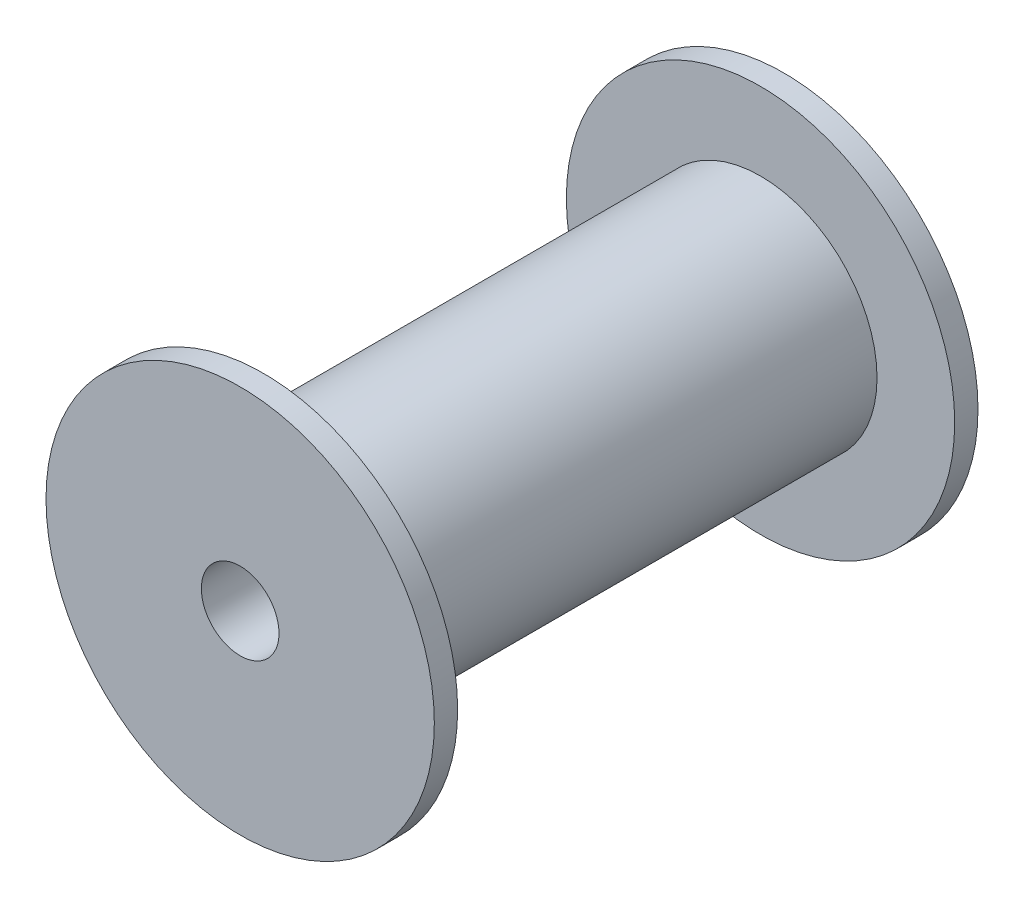
ISO-10303-21;
HEADER;
FILE_DESCRIPTION(('STEP AP214'),'2;1');
FILE_NAME('part.step','',(''),(''),'','','');
FILE_SCHEMA(('AUTOMOTIVE_DESIGN { 1 0 10303 214 1 1 1 1 }'));
ENDSEC;
DATA;
#1=APPLICATION_CONTEXT('core data for automotive mechanical design processes');
#2=APPLICATION_PROTOCOL_DEFINITION('international standard','automotive_design',2000,#1);
#3=PRODUCT_CONTEXT('',#1,'mechanical');
#4=PRODUCT('Part','Part','',(#3));
#5=PRODUCT_RELATED_PRODUCT_CATEGORY('part','',(#4));
#6=PRODUCT_DEFINITION_FORMATION('','',#4);
#7=PRODUCT_DEFINITION_CONTEXT('part definition',#1,'design');
#8=PRODUCT_DEFINITION('design','',#6,#7);
#9=PRODUCT_DEFINITION_SHAPE('','',#8);
#10=(LENGTH_UNIT() NAMED_UNIT(*) SI_UNIT(.MILLI.,.METRE.));
#11=(NAMED_UNIT(*) PLANE_ANGLE_UNIT() SI_UNIT($,.RADIAN.));
#12=(NAMED_UNIT(*) SI_UNIT($,.STERADIAN.) SOLID_ANGLE_UNIT());
#13=UNCERTAINTY_MEASURE_WITH_UNIT(LENGTH_MEASURE(1.E-05),#10,'distance_accuracy_value','');
#14=(GEOMETRIC_REPRESENTATION_CONTEXT(3) GLOBAL_UNCERTAINTY_ASSIGNED_CONTEXT((#13)) GLOBAL_UNIT_ASSIGNED_CONTEXT((#10,
#11,#12)) REPRESENTATION_CONTEXT('',''));
#15=CARTESIAN_POINT('',(0.,0.,0.));
#16=DIRECTION('',(0.,0.,1.));
#17=DIRECTION('',(1.,0.,0.));
#18=AXIS2_PLACEMENT_3D('',#15,#16,#17);
#19=CARTESIAN_POINT('',(-425.1,65.,-50.));
#20=DIRECTION('',(0.,0.,1.));
#21=DIRECTION('',(1.,0.,0.));
#22=AXIS2_PLACEMENT_3D('',#19,#20,#21);
#23=CYLINDRICAL_SURFACE('',#22,15.);
#24=CARTESIAN_POINT('',(-425.1,65.,-41.5));
#25=DIRECTION('',(0.,0.,1.));
#26=DIRECTION('',(1.,0.,0.));
#27=AXIS2_PLACEMENT_3D('',#24,#25,#26);
#28=CIRCLE('',#27,15.);
#29=CARTESIAN_POINT('',(-410.1,65.,-41.5));
#30=VERTEX_POINT('',#29);
#31=EDGE_CURVE('E11',#30,#30,#28,.F.);
#32=ORIENTED_EDGE('',*,*,#31,.F.);
#33=EDGE_LOOP('',(#32));
#34=FACE_BOUND('',#33,.T.);
#35=CARTESIAN_POINT('',(-425.1,65.,22.5));
#36=DIRECTION('',(0.,0.,1.));
#37=DIRECTION('',(1.,0.,0.));
#38=AXIS2_PLACEMENT_3D('',#35,#36,#37);
#39=CIRCLE('',#38,15.);
#40=CARTESIAN_POINT('',(-410.1,65.,22.5));
#41=VERTEX_POINT('',#40);
#42=EDGE_CURVE('E80',#41,#41,#39,.F.);
#43=ORIENTED_EDGE('',*,*,#42,.T.);
#44=EDGE_LOOP('',(#43));
#45=FACE_BOUND('',#44,.T.);
#46=ADVANCED_FACE('F61',(#34,#45),#23,.T.);
#47=CARTESIAN_POINT('',(-425.1,65.,-50.));
#48=DIRECTION('',(0.,0.,1.));
#49=DIRECTION('',(1.,0.,0.));
#50=AXIS2_PLACEMENT_3D('',#47,#48,#49);
#51=CIRCLE('',#50,15.);
#52=CARTESIAN_POINT('',(-410.1,65.,-50.));
#53=VERTEX_POINT('',#52);
#54=EDGE_CURVE('E69',#53,#53,#51,.T.);
#55=ORIENTED_EDGE('',*,*,#54,.T.);
#56=EDGE_LOOP('',(#55));
#57=FACE_BOUND('',#56,.T.);
#58=CARTESIAN_POINT('',(-425.1,65.,-44.5));
#59=DIRECTION('',(0.,0.,1.));
#60=DIRECTION('',(1.,0.,0.));
#61=AXIS2_PLACEMENT_3D('',#58,#59,#60);
#62=CIRCLE('',#61,15.);
#63=CARTESIAN_POINT('',(-410.1,65.,-44.5));
#64=VERTEX_POINT('',#63);
#65=EDGE_CURVE('E74',#64,#64,#62,.F.);
#66=ORIENTED_EDGE('',*,*,#65,.T.);
#67=EDGE_LOOP('',(#66));
#68=FACE_BOUND('',#67,.T.);
#69=ADVANCED_FACE('F119',(#57,#68),#23,.T.);
#70=CARTESIAN_POINT('',(-425.1,65.,-50.));
#71=DIRECTION('',(0.,0.,1.));
#72=DIRECTION('',(1.,0.,0.));
#73=AXIS2_PLACEMENT_3D('',#70,#71,#72);
#74=PLANE('',#73);
#75=CARTESIAN_POINT('',(-425.1,65.,-50.));
#76=DIRECTION('',(0.,0.,1.));
#77=DIRECTION('',(1.,0.,0.));
#78=AXIS2_PLACEMENT_3D('',#75,#76,#77);
#79=CIRCLE('',#78,13.);
#80=CARTESIAN_POINT('',(-412.1,65.,-50.));
#81=VERTEX_POINT('',#80);
#82=EDGE_CURVE('E164',#81,#81,#79,.T.);
#83=ORIENTED_EDGE('',*,*,#82,.T.);
#84=EDGE_LOOP('',(#83));
#85=FACE_BOUND('',#84,.T.);
#86=ORIENTED_EDGE('',*,*,#54,.F.);
#87=EDGE_LOOP('',(#86));
#88=FACE_BOUND('',#87,.T.);
#89=ADVANCED_FACE('F63',(#85,#88),#74,.F.);
#90=CARTESIAN_POINT('',(-425.1,65.,-44.5));
#91=DIRECTION('',(0.,0.,1.));
#92=DIRECTION('',(1.,0.,0.));
#93=AXIS2_PLACEMENT_3D('',#90,#91,#92);
#94=PLANE('',#93);
#95=ORIENTED_EDGE('',*,*,#65,.F.);
#96=EDGE_LOOP('',(#95));
#97=FACE_BOUND('',#96,.T.);
#98=CARTESIAN_POINT('',(-425.1,65.,-44.5));
#99=DIRECTION('',(0.,0.,1.));
#100=DIRECTION('',(1.,0.,0.));
#101=AXIS2_PLACEMENT_3D('',#98,#99,#100);
#102=CIRCLE('',#101,25.);
#103=CARTESIAN_POINT('',(-400.1,65.,-44.5));
#104=VERTEX_POINT('',#103);
#105=EDGE_CURVE('E82',#104,#104,#102,.T.);
#106=ORIENTED_EDGE('',*,*,#105,.F.);
#107=EDGE_LOOP('',(#106));
#108=FACE_BOUND('',#107,.T.);
#109=ADVANCED_FACE('F109',(#97,#108),#94,.F.);
#110=CARTESIAN_POINT('',(-425.1,65.,-41.5));
#111=DIRECTION('',(0.,0.,1.));
#112=DIRECTION('',(1.,0.,0.));
#113=AXIS2_PLACEMENT_3D('',#110,#111,#112);
#114=PLANE('',#113);
#115=ORIENTED_EDGE('',*,*,#31,.T.);
#116=EDGE_LOOP('',(#115));
#117=FACE_BOUND('',#116,.T.);
#118=CARTESIAN_POINT('',(-425.1,65.,-41.5));
#119=DIRECTION('',(0.,0.,1.));
#120=DIRECTION('',(1.,0.,0.));
#121=AXIS2_PLACEMENT_3D('',#118,#119,#120);
#122=CIRCLE('',#121,25.);
#123=CARTESIAN_POINT('',(-400.1,65.,-41.5));
#124=VERTEX_POINT('',#123);
#125=EDGE_CURVE('E79',#124,#124,#122,.T.);
#126=ORIENTED_EDGE('',*,*,#125,.T.);
#127=EDGE_LOOP('',(#126));
#128=FACE_BOUND('',#127,.T.);
#129=ADVANCED_FACE('F100',(#117,#128),#114,.T.);
#130=CARTESIAN_POINT('',(-425.1,65.,-44.5));
#131=DIRECTION('',(0.,0.,1.));
#132=DIRECTION('',(1.,0.,0.));
#133=AXIS2_PLACEMENT_3D('',#130,#131,#132);
#134=CYLINDRICAL_SURFACE('',#133,25.);
#135=ORIENTED_EDGE('',*,*,#125,.F.);
#136=EDGE_LOOP('',(#135));
#137=FACE_BOUND('',#136,.T.);
#138=ORIENTED_EDGE('',*,*,#105,.T.);
#139=EDGE_LOOP('',(#138));
#140=FACE_BOUND('',#139,.T.);
#141=ADVANCED_FACE('F102',(#137,#140),#134,.T.);
#142=CARTESIAN_POINT('',(-425.1,65.,22.5));
#143=DIRECTION('',(0.,0.,1.));
#144=DIRECTION('',(1.,0.,0.));
#145=AXIS2_PLACEMENT_3D('',#142,#143,#144);
#146=PLANE('',#145);
#147=ORIENTED_EDGE('',*,*,#42,.F.);
#148=EDGE_LOOP('',(#147));
#149=FACE_BOUND('',#148,.T.);
#150=CARTESIAN_POINT('',(-425.1,65.,22.5));
#151=DIRECTION('',(0.,0.,1.));
#152=DIRECTION('',(1.,0.,0.));
#153=AXIS2_PLACEMENT_3D('',#150,#151,#152);
#154=CIRCLE('',#153,25.);
#155=CARTESIAN_POINT('',(-400.1,65.,22.5));
#156=VERTEX_POINT('',#155);
#157=EDGE_CURVE('E89',#156,#156,#154,.T.);
#158=ORIENTED_EDGE('',*,*,#157,.F.);
#159=EDGE_LOOP('',(#158));
#160=FACE_BOUND('',#159,.T.);
#161=ADVANCED_FACE('F105',(#149,#160),#146,.F.);
#162=CARTESIAN_POINT('',(-425.1,65.,22.5));
#163=DIRECTION('',(0.,0.,1.));
#164=DIRECTION('',(1.,0.,0.));
#165=AXIS2_PLACEMENT_3D('',#162,#163,#164);
#166=CYLINDRICAL_SURFACE('',#165,25.);
#167=CARTESIAN_POINT('',(-425.1,65.,25.5));
#168=DIRECTION('',(0.,0.,1.));
#169=DIRECTION('',(1.,0.,0.));
#170=AXIS2_PLACEMENT_3D('',#167,#168,#169);
#171=CIRCLE('',#170,25.);
#172=CARTESIAN_POINT('',(-400.1,65.,25.5));
#173=VERTEX_POINT('',#172);
#174=EDGE_CURVE('E83',#173,#173,#171,.T.);
#175=ORIENTED_EDGE('',*,*,#174,.F.);
#176=EDGE_LOOP('',(#175));
#177=FACE_BOUND('',#176,.T.);
#178=ORIENTED_EDGE('',*,*,#157,.T.);
#179=EDGE_LOOP('',(#178));
#180=FACE_BOUND('',#179,.T.);
#181=ADVANCED_FACE('F113',(#177,#180),#166,.T.);
#182=CARTESIAN_POINT('',(-425.1,65.,25.5));
#183=DIRECTION('',(0.,0.,1.));
#184=DIRECTION('',(1.,0.,0.));
#185=AXIS2_PLACEMENT_3D('',#182,#183,#184);
#186=PLANE('',#185);
#187=CARTESIAN_POINT('',(-425.1,65.,25.5));
#188=DIRECTION('',(0.,0.,1.));
#189=DIRECTION('',(1.,0.,0.));
#190=AXIS2_PLACEMENT_3D('',#187,#188,#189);
#191=CIRCLE('',#190,5.);
#192=CARTESIAN_POINT('',(-420.1,65.,25.5));
#193=VERTEX_POINT('',#192);
#194=EDGE_CURVE('E94',#193,#193,#191,.T.);
#195=ORIENTED_EDGE('',*,*,#194,.F.);
#196=EDGE_LOOP('',(#195));
#197=FACE_BOUND('',#196,.T.);
#198=ORIENTED_EDGE('',*,*,#174,.T.);
#199=EDGE_LOOP('',(#198));
#200=FACE_BOUND('',#199,.T.);
#201=ADVANCED_FACE('F124',(#197,#200),#186,.T.);
#202=CARTESIAN_POINT('',(-425.1,65.,-50.));
#203=DIRECTION('',(0.,0.,1.));
#204=DIRECTION('',(1.,0.,0.));
#205=AXIS2_PLACEMENT_3D('',#202,#203,#204);
#206=CYLINDRICAL_SURFACE('',#205,5.);
#207=CARTESIAN_POINT('',(-425.1,65.,-42.));
#208=DIRECTION('',(0.,0.,1.));
#209=DIRECTION('',(1.,0.,0.));
#210=AXIS2_PLACEMENT_3D('',#207,#208,#209);
#211=CIRCLE('',#210,5.);
#212=CARTESIAN_POINT('',(-420.1,65.,-42.));
#213=VERTEX_POINT('',#212);
#214=EDGE_CURVE('E65',#213,#213,#211,.F.);
#215=ORIENTED_EDGE('',*,*,#214,.T.);
#216=EDGE_LOOP('',(#215));
#217=FACE_BOUND('',#216,.T.);
#218=ORIENTED_EDGE('',*,*,#194,.T.);
#219=EDGE_LOOP('',(#218));
#220=FACE_BOUND('',#219,.T.);
#221=ADVANCED_FACE('F134',(#217,#220),#206,.F.);
#222=CARTESIAN_POINT('',(-425.1,65.,-42.));
#223=DIRECTION('',(0.,0.,1.));
#224=DIRECTION('',(1.,0.,0.));
#225=AXIS2_PLACEMENT_3D('',#222,#223,#224);
#226=PLANE('',#225);
#227=CARTESIAN_POINT('',(-425.1,65.,-42.));
#228=DIRECTION('',(0.,0.,1.));
#229=DIRECTION('',(1.,0.,0.));
#230=AXIS2_PLACEMENT_3D('',#227,#228,#229);
#231=CIRCLE('',#230,13.);
#232=CARTESIAN_POINT('',(-412.1,65.,-42.));
#233=VERTEX_POINT('',#232);
#234=EDGE_CURVE('E161',#233,#233,#231,.T.);
#235=ORIENTED_EDGE('',*,*,#234,.F.);
#236=EDGE_LOOP('',(#235));
#237=FACE_BOUND('',#236,.T.);
#238=ORIENTED_EDGE('',*,*,#214,.F.);
#239=EDGE_LOOP('',(#238));
#240=FACE_BOUND('',#239,.T.);
#241=ADVANCED_FACE('F139',(#237,#240),#226,.F.);
#242=CARTESIAN_POINT('',(-425.1,65.,-50.));
#243=DIRECTION('',(0.,0.,1.));
#244=DIRECTION('',(1.,0.,0.));
#245=AXIS2_PLACEMENT_3D('',#242,#243,#244);
#246=CYLINDRICAL_SURFACE('',#245,13.);
#247=ORIENTED_EDGE('',*,*,#234,.T.);
#248=EDGE_LOOP('',(#247));
#249=FACE_BOUND('',#248,.T.);
#250=ORIENTED_EDGE('',*,*,#82,.F.);
#251=EDGE_LOOP('',(#250));
#252=FACE_BOUND('',#251,.T.);
#253=ADVANCED_FACE('F152',(#249,#252),#246,.F.);
#254=CLOSED_SHELL('',(#46,#69,#89,#109,#129,#141,#161,#181,#201,#221,#241,#253));
#255=MANIFOLD_SOLID_BREP('B2',#254);
#256=ADVANCED_BREP_SHAPE_REPRESENTATION('',(#18,#255),#14);
#257=SHAPE_DEFINITION_REPRESENTATION(#9,#256);
ENDSEC;
END-ISO-10303-21;
